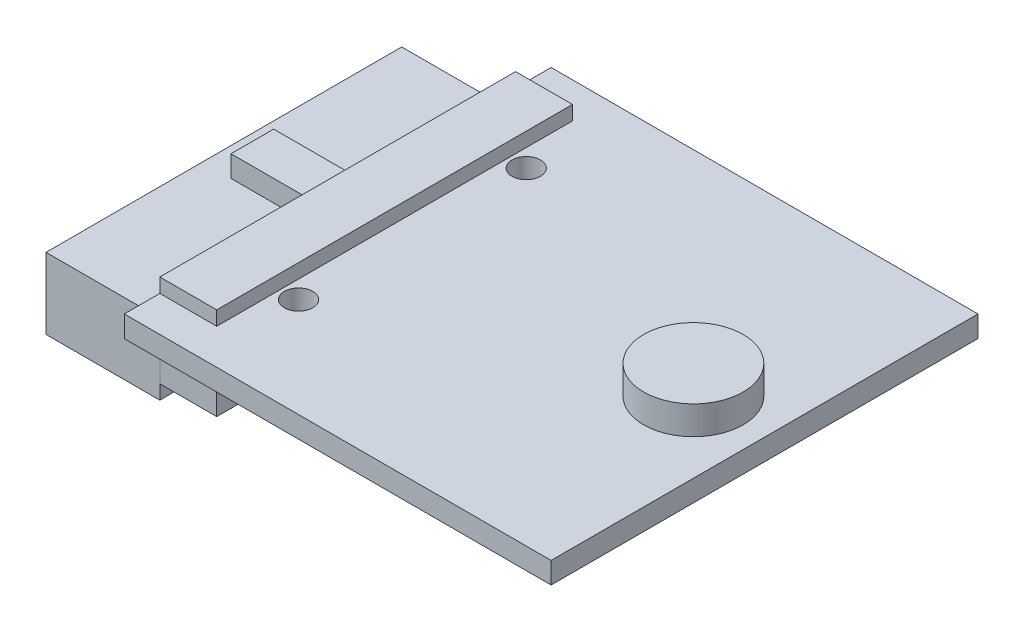
ISO-10303-21;
HEADER;
FILE_DESCRIPTION(('STEP AP214'),'2;1');
FILE_NAME('part.step','',(''),(''),'','','');
FILE_SCHEMA(('AUTOMOTIVE_DESIGN { 1 0 10303 214 1 1 1 1 }'));
ENDSEC;
DATA;
#1=APPLICATION_CONTEXT('core data for automotive mechanical design processes');
#2=APPLICATION_PROTOCOL_DEFINITION('international standard','automotive_design',2000,#1);
#3=PRODUCT_CONTEXT('',#1,'mechanical');
#4=PRODUCT('Part','Part','',(#3));
#5=PRODUCT_RELATED_PRODUCT_CATEGORY('part','',(#4));
#6=PRODUCT_DEFINITION_FORMATION('','',#4);
#7=PRODUCT_DEFINITION_CONTEXT('part definition',#1,'design');
#8=PRODUCT_DEFINITION('design','',#6,#7);
#9=PRODUCT_DEFINITION_SHAPE('','',#8);
#10=(LENGTH_UNIT() NAMED_UNIT(*) SI_UNIT(.MILLI.,.METRE.));
#11=(NAMED_UNIT(*) PLANE_ANGLE_UNIT() SI_UNIT($,.RADIAN.));
#12=(NAMED_UNIT(*) SI_UNIT($,.STERADIAN.) SOLID_ANGLE_UNIT());
#13=UNCERTAINTY_MEASURE_WITH_UNIT(LENGTH_MEASURE(1.E-05),#10,'distance_accuracy_value','');
#14=(GEOMETRIC_REPRESENTATION_CONTEXT(3) GLOBAL_UNCERTAINTY_ASSIGNED_CONTEXT((#13)) GLOBAL_UNIT_ASSIGNED_CONTEXT((#10,
#11,#12)) REPRESENTATION_CONTEXT('',''));
#15=CARTESIAN_POINT('',(0.,0.,0.));
#16=DIRECTION('',(0.,0.,1.));
#17=DIRECTION('',(1.,0.,0.));
#18=AXIS2_PLACEMENT_3D('',#15,#16,#17);
#19=CARTESIAN_POINT('',(0.,2.5,12.5));
#20=DIRECTION('',(0.,0.,1.));
#21=DIRECTION('',(1.,0.,0.));
#22=AXIS2_PLACEMENT_3D('',#19,#20,#21);
#23=PLANE('',#22);
#24=DIRECTION('',(0.,-1.,0.));
#25=VECTOR('',#24,1.);
#26=CARTESIAN_POINT('',(-15.,2.5,12.5));
#27=LINE('',#26,#25);
#28=CARTESIAN_POINT('',(-15.,2.5,12.5));
#29=VERTEX_POINT('',#28);
#30=CARTESIAN_POINT('',(-15.,-4.,12.5));
#31=VERTEX_POINT('',#30);
#32=EDGE_CURVE('E105',#29,#31,#27,.T.);
#33=ORIENTED_EDGE('',*,*,#32,.T.);
#34=DIRECTION('',(-1.,0.,0.));
#35=VECTOR('',#34,1.);
#36=CARTESIAN_POINT('',(0.,-4.,12.5));
#37=LINE('',#36,#35);
#38=CARTESIAN_POINT('',(-11.,-4.,12.5));
#39=VERTEX_POINT('',#38);
#40=EDGE_CURVE('E101',#39,#31,#37,.T.);
#41=ORIENTED_EDGE('',*,*,#40,.F.);
#42=DIRECTION('',(0.,-1.,0.));
#43=VECTOR('',#42,1.);
#44=CARTESIAN_POINT('',(-11.,2.5,12.5));
#45=LINE('',#44,#43);
#46=CARTESIAN_POINT('',(-11.,2.5,12.5));
#47=VERTEX_POINT('',#46);
#48=EDGE_CURVE('E12',#47,#39,#45,.T.);
#49=ORIENTED_EDGE('',*,*,#48,.F.);
#50=DIRECTION('',(-1.,0.,0.));
#51=VECTOR('',#50,1.);
#52=CARTESIAN_POINT('',(0.,2.5,12.5));
#53=LINE('',#52,#51);
#54=EDGE_CURVE('E111',#47,#29,#53,.T.);
#55=ORIENTED_EDGE('',*,*,#54,.T.);
#56=EDGE_LOOP('',(#33,#41,#49,#55));
#57=FACE_BOUND('',#56,.T.);
#58=ADVANCED_FACE('F47',(#57),#23,.T.);
#59=CARTESIAN_POINT('',(-11.,2.5,0.));
#60=DIRECTION('',(1.,0.,0.));
#61=DIRECTION('',(0.,0.,-1.));
#62=AXIS2_PLACEMENT_3D('',#59,#60,#61);
#63=PLANE('',#62);
#64=ORIENTED_EDGE('',*,*,#48,.T.);
#65=DIRECTION('',(0.,0.,1.));
#66=VECTOR('',#65,1.);
#67=CARTESIAN_POINT('',(-11.,-4.,0.));
#68=LINE('',#67,#66);
#69=CARTESIAN_POINT('',(-11.,-4.,-12.5));
#70=VERTEX_POINT('',#69);
#71=EDGE_CURVE('E90',#70,#39,#68,.T.);
#72=ORIENTED_EDGE('',*,*,#71,.F.);
#73=DIRECTION('',(0.,-1.,0.));
#74=VECTOR('',#73,1.);
#75=CARTESIAN_POINT('',(-11.,2.5,-12.5));
#76=LINE('',#75,#74);
#77=CARTESIAN_POINT('',(-11.,2.5,-12.5));
#78=VERTEX_POINT('',#77);
#79=EDGE_CURVE('E54',#78,#70,#76,.T.);
#80=ORIENTED_EDGE('',*,*,#79,.F.);
#81=DIRECTION('',(0.,0.,1.));
#82=VECTOR('',#81,1.);
#83=CARTESIAN_POINT('',(-11.,2.5,0.));
#84=LINE('',#83,#82);
#85=EDGE_CURVE('E92',#78,#47,#84,.T.);
#86=ORIENTED_EDGE('',*,*,#85,.T.);
#87=EDGE_LOOP('',(#64,#72,#80,#86));
#88=FACE_BOUND('',#87,.T.);
#89=ADVANCED_FACE('F89',(#88),#63,.T.);
#90=CARTESIAN_POINT('',(0.,2.5,-12.5));
#91=DIRECTION('',(0.,0.,-1.));
#92=DIRECTION('',(-1.,0.,0.));
#93=AXIS2_PLACEMENT_3D('',#90,#91,#92);
#94=PLANE('',#93);
#95=ORIENTED_EDGE('',*,*,#79,.T.);
#96=DIRECTION('',(1.,0.,0.));
#97=VECTOR('',#96,1.);
#98=CARTESIAN_POINT('',(0.,-4.,-12.5));
#99=LINE('',#98,#97);
#100=CARTESIAN_POINT('',(-15.,-4.,-12.5));
#101=VERTEX_POINT('',#100);
#102=EDGE_CURVE('E103',#101,#70,#99,.T.);
#103=ORIENTED_EDGE('',*,*,#102,.F.);
#104=DIRECTION('',(0.,-1.,0.));
#105=VECTOR('',#104,1.);
#106=CARTESIAN_POINT('',(-15.,2.5,-12.5));
#107=LINE('',#106,#105);
#108=CARTESIAN_POINT('',(-15.,2.5,-12.5));
#109=VERTEX_POINT('',#108);
#110=EDGE_CURVE('E69',#109,#101,#107,.T.);
#111=ORIENTED_EDGE('',*,*,#110,.F.);
#112=DIRECTION('',(1.,0.,0.));
#113=VECTOR('',#112,1.);
#114=CARTESIAN_POINT('',(0.,2.5,-12.5));
#115=LINE('',#114,#113);
#116=EDGE_CURVE('E114',#109,#78,#115,.T.);
#117=ORIENTED_EDGE('',*,*,#116,.T.);
#118=EDGE_LOOP('',(#95,#103,#111,#117));
#119=FACE_BOUND('',#118,.T.);
#120=ADVANCED_FACE('F118',(#119),#94,.T.);
#121=CARTESIAN_POINT('',(-15.,2.5,0.));
#122=DIRECTION('',(1.,0.,0.));
#123=DIRECTION('',(0.,0.,-1.));
#124=AXIS2_PLACEMENT_3D('',#121,#122,#123);
#125=PLANE('',#124);
#126=ORIENTED_EDGE('',*,*,#110,.T.);
#127=DIRECTION('',(0.,0.,1.));
#128=VECTOR('',#127,1.);
#129=CARTESIAN_POINT('',(-15.,-4.,0.));
#130=LINE('',#129,#128);
#131=EDGE_CURVE('E109',#101,#31,#130,.T.);
#132=ORIENTED_EDGE('',*,*,#131,.T.);
#133=ORIENTED_EDGE('',*,*,#32,.F.);
#134=DIRECTION('',(0.,0.,1.));
#135=VECTOR('',#134,1.);
#136=CARTESIAN_POINT('',(-15.,2.5,0.));
#137=LINE('',#136,#135);
#138=EDGE_CURVE('E61',#109,#29,#137,.T.);
#139=ORIENTED_EDGE('',*,*,#138,.F.);
#140=EDGE_LOOP('',(#126,#132,#133,#139));
#141=FACE_BOUND('',#140,.T.);
#142=ADVANCED_FACE('F121',(#141),#125,.F.);
#143=CARTESIAN_POINT('',(0.,2.5,0.));
#144=DIRECTION('',(0.,1.,0.));
#145=DIRECTION('',(0.,0.,1.));
#146=AXIS2_PLACEMENT_3D('',#143,#144,#145);
#147=PLANE('',#146);
#148=ORIENTED_EDGE('',*,*,#54,.F.);
#149=ORIENTED_EDGE('',*,*,#85,.F.);
#150=ORIENTED_EDGE('',*,*,#116,.F.);
#151=ORIENTED_EDGE('',*,*,#138,.T.);
#152=EDGE_LOOP('',(#148,#149,#150,#151));
#153=FACE_BOUND('',#152,.T.);
#154=ADVANCED_FACE('F119',(#153),#147,.T.);
#155=CARTESIAN_POINT('',(0.,-4.,0.));
#156=DIRECTION('',(0.,1.,0.));
#157=DIRECTION('',(0.,0.,1.));
#158=AXIS2_PLACEMENT_3D('',#155,#156,#157);
#159=PLANE('',#158);
#160=ORIENTED_EDGE('',*,*,#40,.T.);
#161=ORIENTED_EDGE('',*,*,#131,.F.);
#162=ORIENTED_EDGE('',*,*,#102,.T.);
#163=ORIENTED_EDGE('',*,*,#71,.T.);
#164=EDGE_LOOP('',(#160,#161,#162,#163));
#165=FACE_BOUND('',#164,.T.);
#166=ADVANCED_FACE('F99',(#165),#159,.F.);
#167=CLOSED_SHELL('',(#58,#89,#120,#142,#154,#166));
#168=MANIFOLD_SOLID_BREP('B2',#167);
#169=CARTESIAN_POINT('',(0.,-5.,-12.5));
#170=DIRECTION('',(0.,0.,-1.));
#171=DIRECTION('',(-1.,0.,0.));
#172=AXIS2_PLACEMENT_3D('',#169,#170,#171);
#173=PLANE('',#172);
#174=DIRECTION('',(-1.,0.,0.));
#175=VECTOR('',#174,1.);
#176=CARTESIAN_POINT('',(0.,0.,-12.5));
#177=LINE('',#176,#175);
#178=CARTESIAN_POINT('',(-15.,0.,-12.5));
#179=VERTEX_POINT('',#178);
#180=CARTESIAN_POINT('',(-23.,0.,-12.5));
#181=VERTEX_POINT('',#180);
#182=EDGE_CURVE('E247',#179,#181,#177,.T.);
#183=ORIENTED_EDGE('',*,*,#182,.F.);
#184=DIRECTION('',(0.,1.,0.));
#185=VECTOR('',#184,1.);
#186=CARTESIAN_POINT('',(-15.,-5.,-12.5));
#187=LINE('',#186,#185);
#188=CARTESIAN_POINT('',(-15.,-5.,-12.5));
#189=VERTEX_POINT('',#188);
#190=EDGE_CURVE('E45',#189,#179,#187,.T.);
#191=ORIENTED_EDGE('',*,*,#190,.F.);
#192=DIRECTION('',(-1.,0.,0.));
#193=VECTOR('',#192,1.);
#194=CARTESIAN_POINT('',(0.,-5.,-12.5));
#195=LINE('',#194,#193);
#196=CARTESIAN_POINT('',(-23.,-5.,-12.5));
#197=VERTEX_POINT('',#196);
#198=EDGE_CURVE('E242',#189,#197,#195,.T.);
#199=ORIENTED_EDGE('',*,*,#198,.T.);
#200=DIRECTION('',(0.,1.,0.));
#201=VECTOR('',#200,1.);
#202=CARTESIAN_POINT('',(-23.,-5.,-12.5));
#203=LINE('',#202,#201);
#204=EDGE_CURVE('E185',#197,#181,#203,.T.);
#205=ORIENTED_EDGE('',*,*,#204,.T.);
#206=EDGE_LOOP('',(#183,#191,#199,#205));
#207=FACE_BOUND('',#206,.T.);
#208=ADVANCED_FACE('F182',(#207),#173,.T.);
#209=CARTESIAN_POINT('',(-15.,-5.,0.));
#210=DIRECTION('',(-1.,0.,0.));
#211=DIRECTION('',(0.,0.,1.));
#212=AXIS2_PLACEMENT_3D('',#209,#210,#211);
#213=PLANE('',#212);
#214=DIRECTION('',(0.,0.,1.));
#215=VECTOR('',#214,1.);
#216=CARTESIAN_POINT('',(-15.,0.,0.));
#217=LINE('',#216,#215);
#218=CARTESIAN_POINT('',(-15.,0.,12.5));
#219=VERTEX_POINT('',#218);
#220=EDGE_CURVE('E215',#179,#219,#217,.T.);
#221=ORIENTED_EDGE('',*,*,#220,.T.);
#222=DIRECTION('',(0.,1.,0.));
#223=VECTOR('',#222,1.);
#224=CARTESIAN_POINT('',(-15.,-5.,12.5));
#225=LINE('',#224,#223);
#226=CARTESIAN_POINT('',(-15.,-5.,12.5));
#227=VERTEX_POINT('',#226);
#228=EDGE_CURVE('E191',#227,#219,#225,.T.);
#229=ORIENTED_EDGE('',*,*,#228,.F.);
#230=DIRECTION('',(0.,0.,1.));
#231=VECTOR('',#230,1.);
#232=CARTESIAN_POINT('',(-15.,-5.,0.));
#233=LINE('',#232,#231);
#234=EDGE_CURVE('E232',#189,#227,#233,.T.);
#235=ORIENTED_EDGE('',*,*,#234,.F.);
#236=ORIENTED_EDGE('',*,*,#190,.T.);
#237=EDGE_LOOP('',(#221,#229,#235,#236));
#238=FACE_BOUND('',#237,.T.);
#239=ADVANCED_FACE('F257',(#238),#213,.F.);
#240=CARTESIAN_POINT('',(0.,-5.,12.5));
#241=DIRECTION('',(0.,0.,-1.));
#242=DIRECTION('',(-1.,0.,0.));
#243=AXIS2_PLACEMENT_3D('',#240,#241,#242);
#244=PLANE('',#243);
#245=DIRECTION('',(-1.,0.,0.));
#246=VECTOR('',#245,1.);
#247=CARTESIAN_POINT('',(0.,0.,12.5));
#248=LINE('',#247,#246);
#249=CARTESIAN_POINT('',(-23.,0.,12.5));
#250=VERTEX_POINT('',#249);
#251=EDGE_CURVE('E239',#219,#250,#248,.T.);
#252=ORIENTED_EDGE('',*,*,#251,.T.);
#253=DIRECTION('',(0.,1.,0.));
#254=VECTOR('',#253,1.);
#255=CARTESIAN_POINT('',(-23.,-5.,12.5));
#256=LINE('',#255,#254);
#257=CARTESIAN_POINT('',(-23.,-5.,12.5));
#258=VERTEX_POINT('',#257);
#259=EDGE_CURVE('E236',#258,#250,#256,.T.);
#260=ORIENTED_EDGE('',*,*,#259,.F.);
#261=DIRECTION('',(-1.,0.,0.));
#262=VECTOR('',#261,1.);
#263=CARTESIAN_POINT('',(0.,-5.,12.5));
#264=LINE('',#263,#262);
#265=EDGE_CURVE('E227',#227,#258,#264,.T.);
#266=ORIENTED_EDGE('',*,*,#265,.F.);
#267=ORIENTED_EDGE('',*,*,#228,.T.);
#268=EDGE_LOOP('',(#252,#260,#266,#267));
#269=FACE_BOUND('',#268,.T.);
#270=ADVANCED_FACE('F237',(#269),#244,.F.);
#271=CARTESIAN_POINT('',(-23.,-5.,0.));
#272=DIRECTION('',(-1.,0.,0.));
#273=DIRECTION('',(0.,0.,1.));
#274=AXIS2_PLACEMENT_3D('',#271,#272,#273);
#275=PLANE('',#274);
#276=DIRECTION('',(0.,0.,1.));
#277=VECTOR('',#276,1.);
#278=CARTESIAN_POINT('',(-23.,0.,0.));
#279=LINE('',#278,#277);
#280=EDGE_CURVE('E250',#181,#250,#279,.T.);
#281=ORIENTED_EDGE('',*,*,#280,.F.);
#282=ORIENTED_EDGE('',*,*,#204,.F.);
#283=DIRECTION('',(0.,0.,1.));
#284=VECTOR('',#283,1.);
#285=CARTESIAN_POINT('',(-23.,-5.,0.));
#286=LINE('',#285,#284);
#287=EDGE_CURVE('E231',#197,#258,#286,.T.);
#288=ORIENTED_EDGE('',*,*,#287,.T.);
#289=ORIENTED_EDGE('',*,*,#259,.T.);
#290=EDGE_LOOP('',(#281,#282,#288,#289));
#291=FACE_BOUND('',#290,.T.);
#292=ADVANCED_FACE('F241',(#291),#275,.T.);
#293=CARTESIAN_POINT('',(0.,-5.,0.));
#294=DIRECTION('',(0.,1.,0.));
#295=DIRECTION('',(0.,0.,1.));
#296=AXIS2_PLACEMENT_3D('',#293,#294,#295);
#297=PLANE('',#296);
#298=ORIENTED_EDGE('',*,*,#198,.F.);
#299=ORIENTED_EDGE('',*,*,#234,.T.);
#300=ORIENTED_EDGE('',*,*,#265,.T.);
#301=ORIENTED_EDGE('',*,*,#287,.F.);
#302=EDGE_LOOP('',(#298,#299,#300,#301));
#303=FACE_BOUND('',#302,.T.);
#304=ADVANCED_FACE('F230',(#303),#297,.F.);
#305=CARTESIAN_POINT('',(0.,0.,0.));
#306=DIRECTION('',(0.,1.,0.));
#307=DIRECTION('',(0.,0.,1.));
#308=AXIS2_PLACEMENT_3D('',#305,#306,#307);
#309=PLANE('',#308);
#310=ORIENTED_EDGE('',*,*,#182,.T.);
#311=ORIENTED_EDGE('',*,*,#280,.T.);
#312=ORIENTED_EDGE('',*,*,#251,.F.);
#313=ORIENTED_EDGE('',*,*,#220,.F.);
#314=EDGE_LOOP('',(#310,#311,#312,#313));
#315=FACE_BOUND('',#314,.T.);
#316=ADVANCED_FACE('F255',(#315),#309,.T.);
#317=CLOSED_SHELL('',(#208,#239,#270,#292,#304,#316));
#318=MANIFOLD_SOLID_BREP('B6',#317);
#319=CARTESIAN_POINT('',(0.,1.5,0.));
#320=DIRECTION('',(0.,1.,0.));
#321=DIRECTION('',(0.,0.,1.));
#322=AXIS2_PLACEMENT_3D('',#319,#320,#321);
#323=PLANE('',#322);
#324=CARTESIAN_POINT('',(-9.75000000000001,1.5,8.));
#325=DIRECTION('',(0.,1.,0.));
#326=DIRECTION('',(0.,0.,1.));
#327=AXIS2_PLACEMENT_3D('',#324,#325,#326);
#328=CIRCLE('',#327,1.);
#329=CARTESIAN_POINT('',(-9.75000000000001,1.5,9.));
#330=VERTEX_POINT('',#329);
#331=EDGE_CURVE('E414',#330,#330,#328,.T.);
#332=ORIENTED_EDGE('',*,*,#331,.F.);
#333=EDGE_LOOP('',(#332));
#334=FACE_BOUND('',#333,.T.);
#335=CARTESIAN_POINT('',(-9.75000000000001,1.5,-8.));
#336=DIRECTION('',(0.,1.,0.));
#337=DIRECTION('',(0.,0.,1.));
#338=AXIS2_PLACEMENT_3D('',#335,#336,#337);
#339=CIRCLE('',#338,1.);
#340=CARTESIAN_POINT('',(-9.75000000000001,1.5,-7.));
#341=VERTEX_POINT('',#340);
#342=EDGE_CURVE('E407',#341,#341,#339,.T.);
#343=ORIENTED_EDGE('',*,*,#342,.F.);
#344=EDGE_LOOP('',(#343));
#345=FACE_BOUND('',#344,.T.);
#346=DIRECTION('',(-1.,0.,0.));
#347=VECTOR('',#346,1.);
#348=CARTESIAN_POINT('',(0.,1.5,1.5));
#349=LINE('',#348,#347);
#350=CARTESIAN_POINT('',(-15.,1.5,1.5));
#351=VERTEX_POINT('',#350);
#352=CARTESIAN_POINT('',(-21.,1.5,1.5));
#353=VERTEX_POINT('',#352);
#354=EDGE_CURVE('E442',#351,#353,#349,.T.);
#355=ORIENTED_EDGE('',*,*,#354,.F.);
#356=DIRECTION('',(0.,0.,1.));
#357=VECTOR('',#356,1.);
#358=CARTESIAN_POINT('',(-15.,1.5,0.));
#359=LINE('',#358,#357);
#360=CARTESIAN_POINT('',(-15.,1.5,15.));
#361=VERTEX_POINT('',#360);
#362=EDGE_CURVE('E394',#351,#361,#359,.T.);
#363=ORIENTED_EDGE('',*,*,#362,.T.);
#364=DIRECTION('',(1.,0.,0.));
#365=VECTOR('',#364,1.);
#366=CARTESIAN_POINT('',(0.,1.5,15.));
#367=LINE('',#366,#365);
#368=CARTESIAN_POINT('',(15.,1.5,15.));
#369=VERTEX_POINT('',#368);
#370=EDGE_CURVE('E456',#361,#369,#367,.T.);
#371=ORIENTED_EDGE('',*,*,#370,.T.);
#372=DIRECTION('',(0.,0.,1.));
#373=VECTOR('',#372,1.);
#374=CARTESIAN_POINT('',(15.,1.5,0.));
#375=LINE('',#374,#373);
#376=CARTESIAN_POINT('',(15.,1.5,-15.));
#377=VERTEX_POINT('',#376);
#378=EDGE_CURVE('E466',#377,#369,#375,.T.);
#379=ORIENTED_EDGE('',*,*,#378,.F.);
#380=DIRECTION('',(1.,0.,0.));
#381=VECTOR('',#380,1.);
#382=CARTESIAN_POINT('',(0.,1.5,-15.));
#383=LINE('',#382,#381);
#384=CARTESIAN_POINT('',(-15.,1.5,-15.));
#385=VERTEX_POINT('',#384);
#386=EDGE_CURVE('E391',#385,#377,#383,.T.);
#387=ORIENTED_EDGE('',*,*,#386,.F.);
#388=CARTESIAN_POINT('',(-15.,1.5,-1.5));
#389=VERTEX_POINT('',#388);
#390=EDGE_CURVE('E382',#385,#389,#359,.T.);
#391=ORIENTED_EDGE('',*,*,#390,.T.);
#392=DIRECTION('',(1.,0.,0.));
#393=VECTOR('',#392,1.);
#394=CARTESIAN_POINT('',(0.,1.5,-1.5));
#395=LINE('',#394,#393);
#396=CARTESIAN_POINT('',(-21.,1.5,-1.5));
#397=VERTEX_POINT('',#396);
#398=EDGE_CURVE('E388',#397,#389,#395,.T.);
#399=ORIENTED_EDGE('',*,*,#398,.F.);
#400=DIRECTION('',(0.,0.,-1.));
#401=VECTOR('',#400,1.);
#402=CARTESIAN_POINT('',(-21.,1.5,0.));
#403=LINE('',#402,#401);
#404=EDGE_CURVE('E405',#353,#397,#403,.T.);
#405=ORIENTED_EDGE('',*,*,#404,.F.);
#406=EDGE_LOOP('',(#355,#363,#371,#379,#387,#391,#399,#405));
#407=FACE_BOUND('',#406,.T.);
#408=CARTESIAN_POINT('',(9.99999999999999,1.5,0.));
#409=DIRECTION('',(0.,1.,0.));
#410=DIRECTION('',(0.,0.,1.));
#411=AXIS2_PLACEMENT_3D('',#408,#409,#410);
#412=CIRCLE('',#411,3.5);
#413=CARTESIAN_POINT('',(9.99999999999999,1.5,3.5));
#414=VERTEX_POINT('',#413);
#415=EDGE_CURVE('E420',#414,#414,#412,.F.);
#416=ORIENTED_EDGE('',*,*,#415,.T.);
#417=EDGE_LOOP('',(#416));
#418=FACE_BOUND('',#417,.T.);
#419=ADVANCED_FACE('F314',(#334,#345,#407,#418),#323,.T.);
#420=CARTESIAN_POINT('',(0.,1.5,1.5));
#421=DIRECTION('',(0.,0.,1.));
#422=DIRECTION('',(1.,0.,0.));
#423=AXIS2_PLACEMENT_3D('',#420,#421,#422);
#424=PLANE('',#423);
#425=DIRECTION('',(-1.,0.,0.));
#426=VECTOR('',#425,1.);
#427=CARTESIAN_POINT('',(0.,0.,1.5));
#428=LINE('',#427,#426);
#429=CARTESIAN_POINT('',(-15.,0.,1.5));
#430=VERTEX_POINT('',#429);
#431=CARTESIAN_POINT('',(-21.,0.,1.5));
#432=VERTEX_POINT('',#431);
#433=EDGE_CURVE('E417',#430,#432,#428,.T.);
#434=ORIENTED_EDGE('',*,*,#433,.F.);
#435=DIRECTION('',(0.,-1.,0.));
#436=VECTOR('',#435,1.);
#437=CARTESIAN_POINT('',(-15.,1.5,1.5));
#438=LINE('',#437,#436);
#439=EDGE_CURVE('E180',#351,#430,#438,.T.);
#440=ORIENTED_EDGE('',*,*,#439,.F.);
#441=ORIENTED_EDGE('',*,*,#354,.T.);
#442=DIRECTION('',(0.,-1.,0.));
#443=VECTOR('',#442,1.);
#444=CARTESIAN_POINT('',(-21.,1.5,1.5));
#445=LINE('',#444,#443);
#446=EDGE_CURVE('E331',#353,#432,#445,.T.);
#447=ORIENTED_EDGE('',*,*,#446,.T.);
#448=EDGE_LOOP('',(#434,#440,#441,#447));
#449=FACE_BOUND('',#448,.T.);
#450=ADVANCED_FACE('F316',(#449),#424,.T.);
#451=CARTESIAN_POINT('',(-15.,1.5,0.));
#452=DIRECTION('',(1.,0.,0.));
#453=DIRECTION('',(0.,0.,-1.));
#454=AXIS2_PLACEMENT_3D('',#451,#452,#453);
#455=PLANE('',#454);
#456=DIRECTION('',(0.,0.,1.));
#457=VECTOR('',#456,1.);
#458=CARTESIAN_POINT('',(-15.,0.,0.));
#459=LINE('',#458,#457);
#460=CARTESIAN_POINT('',(-15.,0.,15.));
#461=VERTEX_POINT('',#460);
#462=EDGE_CURVE('E419',#430,#461,#459,.T.);
#463=ORIENTED_EDGE('',*,*,#462,.T.);
#464=DIRECTION('',(0.,-1.,0.));
#465=VECTOR('',#464,1.);
#466=CARTESIAN_POINT('',(-15.,1.5,15.));
#467=LINE('',#466,#465);
#468=EDGE_CURVE('E323',#361,#461,#467,.T.);
#469=ORIENTED_EDGE('',*,*,#468,.F.);
#470=ORIENTED_EDGE('',*,*,#362,.F.);
#471=ORIENTED_EDGE('',*,*,#439,.T.);
#472=EDGE_LOOP('',(#463,#469,#470,#471));
#473=FACE_BOUND('',#472,.T.);
#474=ADVANCED_FACE('F497',(#473),#455,.F.);
#475=CARTESIAN_POINT('',(0.,1.5,15.));
#476=DIRECTION('',(0.,0.,-1.));
#477=DIRECTION('',(-1.,0.,0.));
#478=AXIS2_PLACEMENT_3D('',#475,#476,#477);
#479=PLANE('',#478);
#480=DIRECTION('',(1.,0.,0.));
#481=VECTOR('',#480,1.);
#482=CARTESIAN_POINT('',(0.,0.,15.));
#483=LINE('',#482,#481);
#484=CARTESIAN_POINT('',(15.,0.,15.));
#485=VERTEX_POINT('',#484);
#486=EDGE_CURVE('E422',#461,#485,#483,.T.);
#487=ORIENTED_EDGE('',*,*,#486,.T.);
#488=DIRECTION('',(0.,-1.,0.));
#489=VECTOR('',#488,1.);
#490=CARTESIAN_POINT('',(15.,1.5,15.));
#491=LINE('',#490,#489);
#492=EDGE_CURVE('E448',#369,#485,#491,.T.);
#493=ORIENTED_EDGE('',*,*,#492,.F.);
#494=ORIENTED_EDGE('',*,*,#370,.F.);
#495=ORIENTED_EDGE('',*,*,#468,.T.);
#496=EDGE_LOOP('',(#487,#493,#494,#495));
#497=FACE_BOUND('',#496,.T.);
#498=ADVANCED_FACE('F454',(#497),#479,.F.);
#499=CARTESIAN_POINT('',(15.,1.5,0.));
#500=DIRECTION('',(1.,0.,0.));
#501=DIRECTION('',(0.,0.,-1.));
#502=AXIS2_PLACEMENT_3D('',#499,#500,#501);
#503=PLANE('',#502);
#504=DIRECTION('',(0.,0.,1.));
#505=VECTOR('',#504,1.);
#506=CARTESIAN_POINT('',(15.,0.,0.));
#507=LINE('',#506,#505);
#508=CARTESIAN_POINT('',(15.,0.,-15.));
#509=VERTEX_POINT('',#508);
#510=EDGE_CURVE('E425',#509,#485,#507,.T.);
#511=ORIENTED_EDGE('',*,*,#510,.F.);
#512=DIRECTION('',(0.,-1.,0.));
#513=VECTOR('',#512,1.);
#514=CARTESIAN_POINT('',(15.,1.5,-15.));
#515=LINE('',#514,#513);
#516=EDGE_CURVE('E446',#377,#509,#515,.T.);
#517=ORIENTED_EDGE('',*,*,#516,.F.);
#518=ORIENTED_EDGE('',*,*,#378,.T.);
#519=ORIENTED_EDGE('',*,*,#492,.T.);
#520=EDGE_LOOP('',(#511,#517,#518,#519));
#521=FACE_BOUND('',#520,.T.);
#522=ADVANCED_FACE('F464',(#521),#503,.T.);
#523=CARTESIAN_POINT('',(0.,1.5,-15.));
#524=DIRECTION('',(0.,0.,-1.));
#525=DIRECTION('',(-1.,0.,0.));
#526=AXIS2_PLACEMENT_3D('',#523,#524,#525);
#527=PLANE('',#526);
#528=DIRECTION('',(1.,0.,0.));
#529=VECTOR('',#528,1.);
#530=CARTESIAN_POINT('',(0.,0.,-15.));
#531=LINE('',#530,#529);
#532=CARTESIAN_POINT('',(-15.,0.,-15.));
#533=VERTEX_POINT('',#532);
#534=EDGE_CURVE('E428',#533,#509,#531,.T.);
#535=ORIENTED_EDGE('',*,*,#534,.F.);
#536=DIRECTION('',(0.,-1.,0.));
#537=VECTOR('',#536,1.);
#538=CARTESIAN_POINT('',(-15.,1.5,-15.));
#539=LINE('',#538,#537);
#540=EDGE_CURVE('E402',#385,#533,#539,.T.);
#541=ORIENTED_EDGE('',*,*,#540,.F.);
#542=ORIENTED_EDGE('',*,*,#386,.T.);
#543=ORIENTED_EDGE('',*,*,#516,.T.);
#544=EDGE_LOOP('',(#535,#541,#542,#543));
#545=FACE_BOUND('',#544,.T.);
#546=ADVANCED_FACE('F515',(#545),#527,.T.);
#547=CARTESIAN_POINT('',(-15.,0.,-1.5));
#548=VERTEX_POINT('',#547);
#549=EDGE_CURVE('E399',#533,#548,#459,.T.);
#550=ORIENTED_EDGE('',*,*,#549,.T.);
#551=DIRECTION('',(0.,-1.,0.));
#552=VECTOR('',#551,1.);
#553=CARTESIAN_POINT('',(-15.,1.5,-1.5));
#554=LINE('',#553,#552);
#555=EDGE_CURVE('E396',#389,#548,#554,.T.);
#556=ORIENTED_EDGE('',*,*,#555,.F.);
#557=ORIENTED_EDGE('',*,*,#390,.F.);
#558=ORIENTED_EDGE('',*,*,#540,.T.);
#559=EDGE_LOOP('',(#550,#556,#557,#558));
#560=FACE_BOUND('',#559,.T.);
#561=ADVANCED_FACE('F397',(#560),#455,.F.);
#562=CARTESIAN_POINT('',(0.,1.5,-1.5));
#563=DIRECTION('',(0.,0.,-1.));
#564=DIRECTION('',(-1.,0.,0.));
#565=AXIS2_PLACEMENT_3D('',#562,#563,#564);
#566=PLANE('',#565);
#567=DIRECTION('',(1.,0.,0.));
#568=VECTOR('',#567,1.);
#569=CARTESIAN_POINT('',(0.,0.,-1.5));
#570=LINE('',#569,#568);
#571=CARTESIAN_POINT('',(-21.,0.,-1.5));
#572=VERTEX_POINT('',#571);
#573=EDGE_CURVE('E431',#572,#548,#570,.T.);
#574=ORIENTED_EDGE('',*,*,#573,.F.);
#575=DIRECTION('',(0.,-1.,0.));
#576=VECTOR('',#575,1.);
#577=CARTESIAN_POINT('',(-21.,1.5,-1.5));
#578=LINE('',#577,#576);
#579=EDGE_CURVE('E356',#397,#572,#578,.T.);
#580=ORIENTED_EDGE('',*,*,#579,.F.);
#581=ORIENTED_EDGE('',*,*,#398,.T.);
#582=ORIENTED_EDGE('',*,*,#555,.T.);
#583=EDGE_LOOP('',(#574,#580,#581,#582));
#584=FACE_BOUND('',#583,.T.);
#585=ADVANCED_FACE('F404',(#584),#566,.T.);
#586=CARTESIAN_POINT('',(-9.75000000000001,1.5,-8.));
#587=DIRECTION('',(0.,-1.,0.));
#588=DIRECTION('',(0.,0.,-1.));
#589=AXIS2_PLACEMENT_3D('',#586,#587,#588);
#590=CYLINDRICAL_SURFACE('',#589,1.);
#591=ORIENTED_EDGE('',*,*,#342,.T.);
#592=EDGE_LOOP('',(#591));
#593=FACE_BOUND('',#592,.T.);
#594=CARTESIAN_POINT('',(-9.75000000000001,0.,-8.));
#595=DIRECTION('',(0.,1.,0.));
#596=DIRECTION('',(0.,0.,1.));
#597=AXIS2_PLACEMENT_3D('',#594,#595,#596);
#598=CIRCLE('',#597,1.);
#599=CARTESIAN_POINT('',(-9.75000000000001,0.,-7.));
#600=VERTEX_POINT('',#599);
#601=EDGE_CURVE('E436',#600,#600,#598,.T.);
#602=ORIENTED_EDGE('',*,*,#601,.F.);
#603=EDGE_LOOP('',(#602));
#604=FACE_BOUND('',#603,.T.);
#605=ADVANCED_FACE('F505',(#593,#604),#590,.F.);
#606=CARTESIAN_POINT('',(-21.,1.5,0.));
#607=DIRECTION('',(-1.,0.,0.));
#608=DIRECTION('',(0.,0.,1.));
#609=AXIS2_PLACEMENT_3D('',#606,#607,#608);
#610=PLANE('',#609);
#611=DIRECTION('',(0.,0.,-1.));
#612=VECTOR('',#611,1.);
#613=CARTESIAN_POINT('',(-21.,0.,0.));
#614=LINE('',#613,#612);
#615=EDGE_CURVE('E433',#432,#572,#614,.T.);
#616=ORIENTED_EDGE('',*,*,#615,.F.);
#617=ORIENTED_EDGE('',*,*,#446,.F.);
#618=ORIENTED_EDGE('',*,*,#404,.T.);
#619=ORIENTED_EDGE('',*,*,#579,.T.);
#620=EDGE_LOOP('',(#616,#617,#618,#619));
#621=FACE_BOUND('',#620,.T.);
#622=ADVANCED_FACE('F503',(#621),#610,.T.);
#623=CARTESIAN_POINT('',(-9.75000000000001,1.5,8.));
#624=DIRECTION('',(0.,-1.,0.));
#625=DIRECTION('',(0.,0.,-1.));
#626=AXIS2_PLACEMENT_3D('',#623,#624,#625);
#627=CYLINDRICAL_SURFACE('',#626,1.);
#628=ORIENTED_EDGE('',*,*,#331,.T.);
#629=EDGE_LOOP('',(#628));
#630=FACE_BOUND('',#629,.T.);
#631=CARTESIAN_POINT('',(-9.75000000000001,0.,8.));
#632=DIRECTION('',(0.,1.,0.));
#633=DIRECTION('',(0.,0.,1.));
#634=AXIS2_PLACEMENT_3D('',#631,#632,#633);
#635=CIRCLE('',#634,1.);
#636=CARTESIAN_POINT('',(-9.75000000000001,0.,9.));
#637=VERTEX_POINT('',#636);
#638=EDGE_CURVE('E439',#637,#637,#635,.T.);
#639=ORIENTED_EDGE('',*,*,#638,.F.);
#640=EDGE_LOOP('',(#639));
#641=FACE_BOUND('',#640,.T.);
#642=ADVANCED_FACE('F487',(#630,#641),#627,.F.);
#643=CARTESIAN_POINT('',(0.,0.,0.));
#644=DIRECTION('',(0.,1.,0.));
#645=DIRECTION('',(0.,0.,1.));
#646=AXIS2_PLACEMENT_3D('',#643,#644,#645);
#647=PLANE('',#646);
#648=ORIENTED_EDGE('',*,*,#638,.T.);
#649=EDGE_LOOP('',(#648));
#650=FACE_BOUND('',#649,.T.);
#651=ORIENTED_EDGE('',*,*,#601,.T.);
#652=EDGE_LOOP('',(#651));
#653=FACE_BOUND('',#652,.T.);
#654=ORIENTED_EDGE('',*,*,#433,.T.);
#655=ORIENTED_EDGE('',*,*,#615,.T.);
#656=ORIENTED_EDGE('',*,*,#573,.T.);
#657=ORIENTED_EDGE('',*,*,#549,.F.);
#658=ORIENTED_EDGE('',*,*,#534,.T.);
#659=ORIENTED_EDGE('',*,*,#510,.T.);
#660=ORIENTED_EDGE('',*,*,#486,.F.);
#661=ORIENTED_EDGE('',*,*,#462,.F.);
#662=EDGE_LOOP('',(#654,#655,#656,#657,#658,#659,#660,#661));
#663=FACE_BOUND('',#662,.T.);
#664=ADVANCED_FACE('F460',(#650,#653,#663),#647,.F.);
#665=CARTESIAN_POINT('',(9.99999999999999,3.5,0.));
#666=DIRECTION('',(0.,-1.,0.));
#667=DIRECTION('',(0.,0.,-1.));
#668=AXIS2_PLACEMENT_3D('',#665,#666,#667);
#669=CYLINDRICAL_SURFACE('',#668,3.5);
#670=ORIENTED_EDGE('',*,*,#415,.F.);
#671=EDGE_LOOP('',(#670));
#672=FACE_BOUND('',#671,.T.);
#673=CARTESIAN_POINT('',(9.99999999999999,3.5,0.));
#674=DIRECTION('',(0.,1.,0.));
#675=DIRECTION('',(0.,0.,1.));
#676=AXIS2_PLACEMENT_3D('',#673,#674,#675);
#677=CIRCLE('',#676,3.5);
#678=CARTESIAN_POINT('',(9.99999999999999,3.5,3.5));
#679=VERTEX_POINT('',#678);
#680=EDGE_CURVE('E472',#679,#679,#677,.T.);
#681=ORIENTED_EDGE('',*,*,#680,.F.);
#682=EDGE_LOOP('',(#681));
#683=FACE_BOUND('',#682,.T.);
#684=ADVANCED_FACE('F478',(#672,#683),#669,.T.);
#685=CARTESIAN_POINT('',(9.99999999999999,3.5,0.));
#686=DIRECTION('',(0.,1.,0.));
#687=DIRECTION('',(0.,0.,1.));
#688=AXIS2_PLACEMENT_3D('',#685,#686,#687);
#689=PLANE('',#688);
#690=ORIENTED_EDGE('',*,*,#680,.T.);
#691=EDGE_LOOP('',(#690));
#692=FACE_BOUND('',#691,.T.);
#693=ADVANCED_FACE('F476',(#692),#689,.T.);
#694=CLOSED_SHELL('',(#419,#450,#474,#498,#522,#546,#561,#585,#605,#622,#642,#664,#684,#693));
#695=MANIFOLD_SOLID_BREP('B39',#694);
#696=ADVANCED_BREP_SHAPE_REPRESENTATION('',(#18,#168,#318,#695),#14);
#697=SHAPE_DEFINITION_REPRESENTATION(#9,#696);
ENDSEC;
END-ISO-10303-21;
